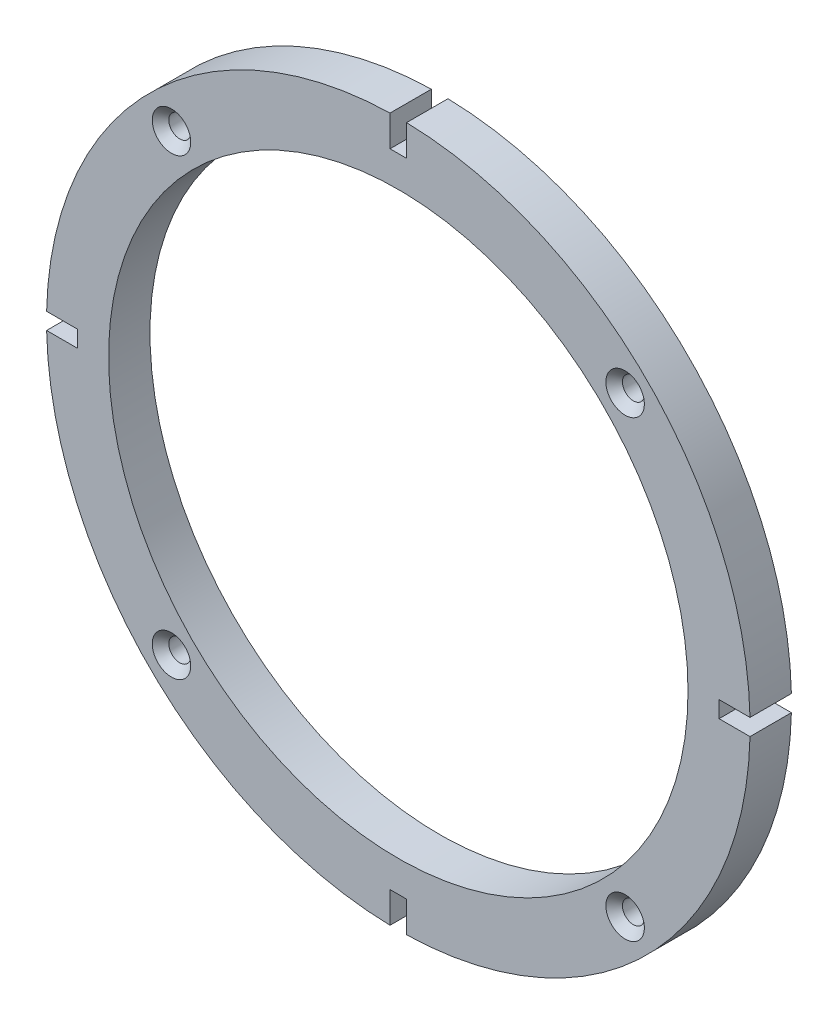
ISO-10303-21;
HEADER;
FILE_DESCRIPTION(('STEP AP214'),'2;1');
FILE_NAME('part.step','',(''),(''),'','','');
FILE_SCHEMA(('AUTOMOTIVE_DESIGN { 1 0 10303 214 1 1 1 1 }'));
ENDSEC;
DATA;
#1=APPLICATION_CONTEXT('core data for automotive mechanical design processes');
#2=APPLICATION_PROTOCOL_DEFINITION('international standard','automotive_design',2000,#1);
#3=PRODUCT_CONTEXT('',#1,'mechanical');
#4=PRODUCT('Part','Part','',(#3));
#5=PRODUCT_RELATED_PRODUCT_CATEGORY('part','',(#4));
#6=PRODUCT_DEFINITION_FORMATION('','',#4);
#7=PRODUCT_DEFINITION_CONTEXT('part definition',#1,'design');
#8=PRODUCT_DEFINITION('design','',#6,#7);
#9=PRODUCT_DEFINITION_SHAPE('','',#8);
#10=(LENGTH_UNIT() NAMED_UNIT(*) SI_UNIT(.MILLI.,.METRE.));
#11=(NAMED_UNIT(*) PLANE_ANGLE_UNIT() SI_UNIT($,.RADIAN.));
#12=(NAMED_UNIT(*) SI_UNIT($,.STERADIAN.) SOLID_ANGLE_UNIT());
#13=UNCERTAINTY_MEASURE_WITH_UNIT(LENGTH_MEASURE(1.E-05),#10,'distance_accuracy_value','');
#14=(GEOMETRIC_REPRESENTATION_CONTEXT(3) GLOBAL_UNCERTAINTY_ASSIGNED_CONTEXT((#13)) GLOBAL_UNIT_ASSIGNED_CONTEXT((#10,
#11,#12)) REPRESENTATION_CONTEXT('',''));
#15=CARTESIAN_POINT('',(0.,0.,0.));
#16=DIRECTION('',(0.,0.,1.));
#17=DIRECTION('',(1.,0.,0.));
#18=AXIS2_PLACEMENT_3D('',#15,#16,#17);
#19=CARTESIAN_POINT('',(-54.8007755419571,54.8007755419608,10.));
#20=DIRECTION('',(0.,0.,-1.));
#21=DIRECTION('',(-1.,0.,0.));
#22=AXIS2_PLACEMENT_3D('',#19,#20,#21);
#23=CYLINDRICAL_SURFACE('',#22,2.65);
#24=CARTESIAN_POINT('',(-54.8007755419571,54.8007755419608,8.00000000000001));
#25=DIRECTION('',(0.,0.,1.));
#26=DIRECTION('',(1.,0.,0.));
#27=AXIS2_PLACEMENT_3D('',#24,#25,#26);
#28=CIRCLE('',#27,2.65);
#29=CARTESIAN_POINT('',(-52.1507755419571,54.8007755419608,8.00000000000001));
#30=VERTEX_POINT('',#29);
#31=EDGE_CURVE('E347',#30,#30,#28,.T.);
#32=ORIENTED_EDGE('',*,*,#31,.T.);
#33=EDGE_LOOP('',(#32));
#34=FACE_BOUND('',#33,.T.);
#35=CARTESIAN_POINT('',(-54.8007755419571,54.8007755419608,2.));
#36=DIRECTION('',(0.,0.,-1.));
#37=DIRECTION('',(-1.,0.,0.));
#38=AXIS2_PLACEMENT_3D('',#35,#36,#37);
#39=CIRCLE('',#38,2.65);
#40=CARTESIAN_POINT('',(-57.4507755419571,54.8007755419608,2.));
#41=VERTEX_POINT('',#40);
#42=EDGE_CURVE('E329',#41,#41,#39,.F.);
#43=ORIENTED_EDGE('',*,*,#42,.F.);
#44=EDGE_LOOP('',(#43));
#45=FACE_BOUND('',#44,.T.);
#46=ADVANCED_FACE('F94',(#34,#45),#23,.F.);
#47=CARTESIAN_POINT('',(-54.8007755419608,-54.8007755419541,10.));
#48=DIRECTION('',(0.,0.,-1.));
#49=DIRECTION('',(-1.,0.,0.));
#50=AXIS2_PLACEMENT_3D('',#47,#48,#49);
#51=CYLINDRICAL_SURFACE('',#50,2.65);
#52=CARTESIAN_POINT('',(-54.8007755419608,-54.8007755419541,8.00000000000001));
#53=DIRECTION('',(0.,0.,1.));
#54=DIRECTION('',(1.,0.,0.));
#55=AXIS2_PLACEMENT_3D('',#52,#53,#54);
#56=CIRCLE('',#55,2.65);
#57=CARTESIAN_POINT('',(-52.1507755419608,-54.8007755419541,8.00000000000001));
#58=VERTEX_POINT('',#57);
#59=EDGE_CURVE('E104',#58,#58,#56,.T.);
#60=ORIENTED_EDGE('',*,*,#59,.T.);
#61=EDGE_LOOP('',(#60));
#62=FACE_BOUND('',#61,.T.);
#63=CARTESIAN_POINT('',(-54.8007755419608,-54.8007755419541,2.));
#64=DIRECTION('',(0.,0.,-1.));
#65=DIRECTION('',(-1.,0.,0.));
#66=AXIS2_PLACEMENT_3D('',#63,#64,#65);
#67=CIRCLE('',#66,2.65);
#68=CARTESIAN_POINT('',(-57.4507755419608,-54.8007755419541,2.));
#69=VERTEX_POINT('',#68);
#70=EDGE_CURVE('E325',#69,#69,#67,.F.);
#71=ORIENTED_EDGE('',*,*,#70,.F.);
#72=EDGE_LOOP('',(#71));
#73=FACE_BOUND('',#72,.T.);
#74=ADVANCED_FACE('F352',(#62,#73),#51,.F.);
#75=CARTESIAN_POINT('',(54.8007755419541,-54.8007755419578,10.));
#76=DIRECTION('',(0.,0.,-1.));
#77=DIRECTION('',(-1.,0.,0.));
#78=AXIS2_PLACEMENT_3D('',#75,#76,#77);
#79=CYLINDRICAL_SURFACE('',#78,2.65);
#80=CARTESIAN_POINT('',(54.8007755419541,-54.8007755419578,8.00000000000001));
#81=DIRECTION('',(0.,0.,1.));
#82=DIRECTION('',(1.,0.,0.));
#83=AXIS2_PLACEMENT_3D('',#80,#81,#82);
#84=CIRCLE('',#83,2.65);
#85=CARTESIAN_POINT('',(57.4507755419541,-54.8007755419578,8.00000000000001));
#86=VERTEX_POINT('',#85);
#87=EDGE_CURVE('E12',#86,#86,#84,.T.);
#88=ORIENTED_EDGE('',*,*,#87,.T.);
#89=EDGE_LOOP('',(#88));
#90=FACE_BOUND('',#89,.T.);
#91=CARTESIAN_POINT('',(54.8007755419541,-54.8007755419578,2.));
#92=DIRECTION('',(0.,0.,-1.));
#93=DIRECTION('',(-1.,0.,0.));
#94=AXIS2_PLACEMENT_3D('',#91,#92,#93);
#95=CIRCLE('',#94,2.65);
#96=CARTESIAN_POINT('',(52.1507755419541,-54.8007755419578,2.));
#97=VERTEX_POINT('',#96);
#98=EDGE_CURVE('E322',#97,#97,#95,.F.);
#99=ORIENTED_EDGE('',*,*,#98,.F.);
#100=EDGE_LOOP('',(#99));
#101=FACE_BOUND('',#100,.T.);
#102=ADVANCED_FACE('F381',(#90,#101),#79,.F.);
#103=CARTESIAN_POINT('',(54.8007755419577,54.8007755419571,10.));
#104=DIRECTION('',(0.,0.,-1.));
#105=DIRECTION('',(-1.,0.,0.));
#106=AXIS2_PLACEMENT_3D('',#103,#104,#105);
#107=CYLINDRICAL_SURFACE('',#106,2.65);
#108=CARTESIAN_POINT('',(54.8007755419577,54.8007755419571,8.00000000000001));
#109=DIRECTION('',(0.,0.,1.));
#110=DIRECTION('',(1.,0.,0.));
#111=AXIS2_PLACEMENT_3D('',#108,#109,#110);
#112=CIRCLE('',#111,2.65);
#113=CARTESIAN_POINT('',(57.4507755419577,54.8007755419571,8.00000000000001));
#114=VERTEX_POINT('',#113);
#115=EDGE_CURVE('E344',#114,#114,#112,.T.);
#116=ORIENTED_EDGE('',*,*,#115,.T.);
#117=EDGE_LOOP('',(#116));
#118=FACE_BOUND('',#117,.T.);
#119=CARTESIAN_POINT('',(54.8007755419577,54.8007755419571,2.));
#120=DIRECTION('',(0.,0.,-1.));
#121=DIRECTION('',(-1.,0.,0.));
#122=AXIS2_PLACEMENT_3D('',#119,#120,#121);
#123=CIRCLE('',#122,2.65);
#124=CARTESIAN_POINT('',(52.1507755419577,54.8007755419571,2.));
#125=VERTEX_POINT('',#124);
#126=EDGE_CURVE('E317',#125,#125,#123,.F.);
#127=ORIENTED_EDGE('',*,*,#126,.F.);
#128=EDGE_LOOP('',(#127));
#129=FACE_BOUND('',#128,.T.);
#130=ADVANCED_FACE('F364',(#118,#129),#107,.F.);
#131=CARTESIAN_POINT('',(0.,0.,10.));
#132=DIRECTION('',(0.,0.,1.));
#133=DIRECTION('',(1.,0.,0.));
#134=AXIS2_PLACEMENT_3D('',#131,#132,#133);
#135=PLANE('',#134);
#136=CARTESIAN_POINT('',(54.8007755419577,54.8007755419571,10.));
#137=DIRECTION('',(0.,0.,1.));
#138=DIRECTION('',(1.,0.,0.));
#139=AXIS2_PLACEMENT_3D('',#136,#137,#138);
#140=CIRCLE('',#139,4.64999999999999);
#141=CARTESIAN_POINT('',(59.4507755419577,54.8007755419571,10.));
#142=VERTEX_POINT('',#141);
#143=EDGE_CURVE('E341',#142,#142,#140,.F.);
#144=ORIENTED_EDGE('',*,*,#143,.T.);
#145=EDGE_LOOP('',(#144));
#146=FACE_BOUND('',#145,.T.);
#147=CARTESIAN_POINT('',(-54.8007755419571,54.8007755419608,10.));
#148=DIRECTION('',(0.,0.,1.));
#149=DIRECTION('',(1.,0.,0.));
#150=AXIS2_PLACEMENT_3D('',#147,#148,#149);
#151=CIRCLE('',#150,4.64999999999999);
#152=CARTESIAN_POINT('',(-50.1507755419572,54.8007755419608,10.));
#153=VERTEX_POINT('',#152);
#154=EDGE_CURVE('E338',#153,#153,#151,.F.);
#155=ORIENTED_EDGE('',*,*,#154,.T.);
#156=EDGE_LOOP('',(#155));
#157=FACE_BOUND('',#156,.T.);
#158=CARTESIAN_POINT('',(-54.8007755419608,-54.8007755419541,10.));
#159=DIRECTION('',(0.,0.,1.));
#160=DIRECTION('',(1.,0.,0.));
#161=AXIS2_PLACEMENT_3D('',#158,#159,#160);
#162=CIRCLE('',#161,4.64999999999999);
#163=CARTESIAN_POINT('',(-50.1507755419608,-54.8007755419541,10.));
#164=VERTEX_POINT('',#163);
#165=EDGE_CURVE('E335',#164,#164,#162,.F.);
#166=ORIENTED_EDGE('',*,*,#165,.T.);
#167=EDGE_LOOP('',(#166));
#168=FACE_BOUND('',#167,.T.);
#169=CARTESIAN_POINT('',(54.8007755419541,-54.8007755419578,10.));
#170=DIRECTION('',(0.,0.,1.));
#171=DIRECTION('',(1.,0.,0.));
#172=AXIS2_PLACEMENT_3D('',#169,#170,#171);
#173=CIRCLE('',#172,4.64999999999999);
#174=CARTESIAN_POINT('',(59.450775541954,-54.8007755419578,10.));
#175=VERTEX_POINT('',#174);
#176=EDGE_CURVE('E316',#175,#175,#173,.F.);
#177=ORIENTED_EDGE('',*,*,#176,.T.);
#178=EDGE_LOOP('',(#177));
#179=FACE_BOUND('',#178,.T.);
#180=DIRECTION('',(0.,1.,0.));
#181=VECTOR('',#180,1.);
#182=CARTESIAN_POINT('',(-2.00000000000001,77.4995551438957,10.));
#183=LINE('',#182,#181);
#184=CARTESIAN_POINT('',(-2.00000000000001,77.4995551438957,10.));
#185=VERTEX_POINT('',#184);
#186=CARTESIAN_POINT('',(-2.00000000000001,84.9764673306675,10.));
#187=VERTEX_POINT('',#186);
#188=EDGE_CURVE('E283',#185,#187,#183,.T.);
#189=ORIENTED_EDGE('',*,*,#188,.T.);
#190=CARTESIAN_POINT('',(0.,0.,10.));
#191=DIRECTION('',(0.,0.,1.));
#192=DIRECTION('',(1.,0.,0.));
#193=AXIS2_PLACEMENT_3D('',#190,#191,#192);
#194=CIRCLE('',#193,85.);
#195=CARTESIAN_POINT('',(-84.9764673306675,1.99999999999997,10.));
#196=VERTEX_POINT('',#195);
#197=EDGE_CURVE('E176',#187,#196,#194,.T.);
#198=ORIENTED_EDGE('',*,*,#197,.T.);
#199=DIRECTION('',(1.,0.,0.));
#200=VECTOR('',#199,1.);
#201=CARTESIAN_POINT('',(-84.9764673306675,1.99999999999997,10.));
#202=LINE('',#201,#200);
#203=CARTESIAN_POINT('',(-77.4995551438957,1.99999999999998,10.));
#204=VERTEX_POINT('',#203);
#205=EDGE_CURVE('E731',#196,#204,#202,.T.);
#206=ORIENTED_EDGE('',*,*,#205,.T.);
#207=DIRECTION('',(0.,1.,0.));
#208=VECTOR('',#207,1.);
#209=CARTESIAN_POINT('',(-77.4995551438957,-2.00000000000003,10.));
#210=LINE('',#209,#208);
#211=CARTESIAN_POINT('',(-77.4995551438957,-2.00000000000003,10.));
#212=VERTEX_POINT('',#211);
#213=EDGE_CURVE('E733',#212,#204,#210,.T.);
#214=ORIENTED_EDGE('',*,*,#213,.F.);
#215=DIRECTION('',(-1.,0.,0.));
#216=VECTOR('',#215,1.);
#217=CARTESIAN_POINT('',(-77.4995551438957,-2.00000000000003,10.));
#218=LINE('',#217,#216);
#219=CARTESIAN_POINT('',(-84.9764673306675,-2.00000000000003,10.));
#220=VERTEX_POINT('',#219);
#221=EDGE_CURVE('E736',#212,#220,#218,.T.);
#222=ORIENTED_EDGE('',*,*,#221,.T.);
#223=CARTESIAN_POINT('',(0.,0.,10.));
#224=DIRECTION('',(0.,0.,1.));
#225=DIRECTION('',(1.,0.,0.));
#226=AXIS2_PLACEMENT_3D('',#223,#224,#225);
#227=CIRCLE('',#226,85.);
#228=CARTESIAN_POINT('',(-2.00000000000001,-84.9764673306675,10.));
#229=VERTEX_POINT('',#228);
#230=EDGE_CURVE('E738',#220,#229,#227,.T.);
#231=ORIENTED_EDGE('',*,*,#230,.T.);
#232=DIRECTION('',(0.,1.,0.));
#233=VECTOR('',#232,1.);
#234=CARTESIAN_POINT('',(-1.99999999999998,-84.9764673306675,10.));
#235=LINE('',#234,#233);
#236=CARTESIAN_POINT('',(-1.99999999999998,-77.4995551438957,10.));
#237=VERTEX_POINT('',#236);
#238=EDGE_CURVE('E740',#229,#237,#235,.T.);
#239=ORIENTED_EDGE('',*,*,#238,.T.);
#240=DIRECTION('',(-1.,0.,0.));
#241=VECTOR('',#240,1.);
#242=CARTESIAN_POINT('',(2.00000000000002,-77.4995551438957,10.));
#243=LINE('',#242,#241);
#244=CARTESIAN_POINT('',(2.00000000000002,-77.4995551438957,10.));
#245=VERTEX_POINT('',#244);
#246=EDGE_CURVE('E742',#245,#237,#243,.T.);
#247=ORIENTED_EDGE('',*,*,#246,.F.);
#248=DIRECTION('',(0.,-1.,0.));
#249=VECTOR('',#248,1.);
#250=CARTESIAN_POINT('',(2.00000000000002,-77.4995551438957,10.));
#251=LINE('',#250,#249);
#252=CARTESIAN_POINT('',(2.00000000000002,-84.9764673306675,10.));
#253=VERTEX_POINT('',#252);
#254=EDGE_CURVE('E745',#245,#253,#251,.T.);
#255=ORIENTED_EDGE('',*,*,#254,.T.);
#256=CARTESIAN_POINT('',(0.,0.,10.));
#257=DIRECTION('',(0.,0.,1.));
#258=DIRECTION('',(1.,0.,0.));
#259=AXIS2_PLACEMENT_3D('',#256,#257,#258);
#260=CIRCLE('',#259,85.);
#261=CARTESIAN_POINT('',(84.9764673306675,-2.00000000000001,10.));
#262=VERTEX_POINT('',#261);
#263=EDGE_CURVE('E747',#253,#262,#260,.T.);
#264=ORIENTED_EDGE('',*,*,#263,.T.);
#265=DIRECTION('',(-1.,0.,0.));
#266=VECTOR('',#265,1.);
#267=CARTESIAN_POINT('',(84.9764673306675,-1.99999999999998,10.));
#268=LINE('',#267,#266);
#269=CARTESIAN_POINT('',(77.4995551438957,-1.99999999999999,10.));
#270=VERTEX_POINT('',#269);
#271=EDGE_CURVE('E749',#262,#270,#268,.T.);
#272=ORIENTED_EDGE('',*,*,#271,.T.);
#273=DIRECTION('',(0.,-1.,0.));
#274=VECTOR('',#273,1.);
#275=CARTESIAN_POINT('',(77.4995551438957,2.00000000000002,10.));
#276=LINE('',#275,#274);
#277=CARTESIAN_POINT('',(77.4995551438957,2.00000000000002,10.));
#278=VERTEX_POINT('',#277);
#279=EDGE_CURVE('E751',#278,#270,#276,.T.);
#280=ORIENTED_EDGE('',*,*,#279,.F.);
#281=DIRECTION('',(1.,0.,0.));
#282=VECTOR('',#281,1.);
#283=CARTESIAN_POINT('',(77.4995551438957,2.00000000000002,10.));
#284=LINE('',#283,#282);
#285=CARTESIAN_POINT('',(84.9764673306675,2.00000000000002,10.));
#286=VERTEX_POINT('',#285);
#287=EDGE_CURVE('E224',#278,#286,#284,.T.);
#288=ORIENTED_EDGE('',*,*,#287,.T.);
#289=CARTESIAN_POINT('',(0.,0.,10.));
#290=DIRECTION('',(0.,0.,1.));
#291=DIRECTION('',(1.,0.,0.));
#292=AXIS2_PLACEMENT_3D('',#289,#290,#291);
#293=CIRCLE('',#292,85.);
#294=CARTESIAN_POINT('',(2.,84.9764673306675,10.));
#295=VERTEX_POINT('',#294);
#296=EDGE_CURVE('E215',#286,#295,#293,.T.);
#297=ORIENTED_EDGE('',*,*,#296,.T.);
#298=DIRECTION('',(0.,-1.,0.));
#299=VECTOR('',#298,1.);
#300=CARTESIAN_POINT('',(1.99999999999999,84.9764673306675,10.));
#301=LINE('',#300,#299);
#302=CARTESIAN_POINT('',(1.99999999999999,77.4995551438957,10.));
#303=VERTEX_POINT('',#302);
#304=EDGE_CURVE('E221',#295,#303,#301,.T.);
#305=ORIENTED_EDGE('',*,*,#304,.T.);
#306=DIRECTION('',(1.,0.,0.));
#307=VECTOR('',#306,1.);
#308=CARTESIAN_POINT('',(-2.00000000000001,77.4995551438957,10.));
#309=LINE('',#308,#307);
#310=EDGE_CURVE('E239',#185,#303,#309,.T.);
#311=ORIENTED_EDGE('',*,*,#310,.F.);
#312=EDGE_LOOP('',(#189,#198,#206,#214,#222,#231,#239,#247,#255,#264,#272,#280,#288,#297,#305,#311));
#313=FACE_BOUND('',#312,.T.);
#314=CARTESIAN_POINT('',(0.,0.,10.));
#315=DIRECTION('',(0.,0.,1.));
#316=DIRECTION('',(1.,0.,0.));
#317=AXIS2_PLACEMENT_3D('',#314,#315,#316);
#318=CIRCLE('',#317,70.);
#319=CARTESIAN_POINT('',(70.,0.,10.));
#320=VERTEX_POINT('',#319);
#321=EDGE_CURVE('E247',#320,#320,#318,.T.);
#322=ORIENTED_EDGE('',*,*,#321,.F.);
#323=EDGE_LOOP('',(#322));
#324=FACE_BOUND('',#323,.T.);
#325=ADVANCED_FACE('F217',(#146,#157,#168,#179,#313,#324),#135,.T.);
#326=CARTESIAN_POINT('',(0.,0.,0.));
#327=DIRECTION('',(0.,0.,1.));
#328=DIRECTION('',(1.,0.,0.));
#329=AXIS2_PLACEMENT_3D('',#326,#327,#328);
#330=PLANE('',#329);
#331=CARTESIAN_POINT('',(54.8007755419569,-54.8007755419579,0.));
#332=DIRECTION('',(0.,0.,-1.));
#333=DIRECTION('',(0.,1.,0.));
#334=AXIS2_PLACEMENT_3D('',#331,#332,#333);
#335=CIRCLE('',#334,5.);
#336=CARTESIAN_POINT('',(54.8007755419569,-49.8007755419579,0.));
#337=VERTEX_POINT('',#336);
#338=EDGE_CURVE('E796',#337,#337,#335,.T.);
#339=ORIENTED_EDGE('',*,*,#338,.F.);
#340=EDGE_LOOP('',(#339));
#341=FACE_BOUND('',#340,.T.);
#342=CARTESIAN_POINT('',(-54.8007755419577,-54.8007755419571,0.));
#343=DIRECTION('',(0.,0.,-1.));
#344=DIRECTION('',(1.,0.,0.));
#345=AXIS2_PLACEMENT_3D('',#342,#343,#344);
#346=CIRCLE('',#345,5.);
#347=CARTESIAN_POINT('',(-49.8007755419577,-54.8007755419571,0.));
#348=VERTEX_POINT('',#347);
#349=EDGE_CURVE('E790',#348,#348,#346,.T.);
#350=ORIENTED_EDGE('',*,*,#349,.F.);
#351=EDGE_LOOP('',(#350));
#352=FACE_BOUND('',#351,.T.);
#353=CARTESIAN_POINT('',(-54.8007755419565,54.8007755419583,0.));
#354=DIRECTION('',(0.,0.,-1.));
#355=DIRECTION('',(0.,-1.,0.));
#356=AXIS2_PLACEMENT_3D('',#353,#354,#355);
#357=CIRCLE('',#356,5.);
#358=CARTESIAN_POINT('',(-54.8007755419566,49.8007755419583,0.));
#359=VERTEX_POINT('',#358);
#360=EDGE_CURVE('E722',#359,#359,#357,.T.);
#361=ORIENTED_EDGE('',*,*,#360,.F.);
#362=EDGE_LOOP('',(#361));
#363=FACE_BOUND('',#362,.T.);
#364=CARTESIAN_POINT('',(54.8007755419577,54.8007755419571,0.));
#365=DIRECTION('',(0.,0.,-1.));
#366=DIRECTION('',(-1.,0.,0.));
#367=AXIS2_PLACEMENT_3D('',#364,#365,#366);
#368=CIRCLE('',#367,5.);
#369=CARTESIAN_POINT('',(49.8007755419577,54.8007755419571,0.));
#370=VERTEX_POINT('',#369);
#371=EDGE_CURVE('E332',#370,#370,#368,.T.);
#372=ORIENTED_EDGE('',*,*,#371,.F.);
#373=EDGE_LOOP('',(#372));
#374=FACE_BOUND('',#373,.T.);
#375=DIRECTION('',(0.,1.,0.));
#376=VECTOR('',#375,1.);
#377=CARTESIAN_POINT('',(-2.00000000000001,77.4995551438957,0.));
#378=LINE('',#377,#376);
#379=CARTESIAN_POINT('',(-2.00000000000001,77.4995551438957,0.));
#380=VERTEX_POINT('',#379);
#381=CARTESIAN_POINT('',(-2.00000000000001,84.9764673306675,0.));
#382=VERTEX_POINT('',#381);
#383=EDGE_CURVE('E244',#380,#382,#378,.T.);
#384=ORIENTED_EDGE('',*,*,#383,.F.);
#385=DIRECTION('',(1.,0.,0.));
#386=VECTOR('',#385,1.);
#387=CARTESIAN_POINT('',(-2.00000000000001,77.4995551438957,0.));
#388=LINE('',#387,#386);
#389=CARTESIAN_POINT('',(1.99999999999999,77.4995551438957,0.));
#390=VERTEX_POINT('',#389);
#391=EDGE_CURVE('E280',#380,#390,#388,.T.);
#392=ORIENTED_EDGE('',*,*,#391,.T.);
#393=DIRECTION('',(0.,-1.,0.));
#394=VECTOR('',#393,1.);
#395=CARTESIAN_POINT('',(1.99999999999999,84.9764673306675,0.));
#396=LINE('',#395,#394);
#397=CARTESIAN_POINT('',(2.,84.9764673306675,0.));
#398=VERTEX_POINT('',#397);
#399=EDGE_CURVE('E278',#398,#390,#396,.T.);
#400=ORIENTED_EDGE('',*,*,#399,.F.);
#401=CARTESIAN_POINT('',(0.,0.,0.));
#402=DIRECTION('',(0.,0.,1.));
#403=DIRECTION('',(1.,0.,0.));
#404=AXIS2_PLACEMENT_3D('',#401,#402,#403);
#405=CIRCLE('',#404,85.);
#406=CARTESIAN_POINT('',(84.9764673306675,2.00000000000002,0.));
#407=VERTEX_POINT('',#406);
#408=EDGE_CURVE('E233',#407,#398,#405,.T.);
#409=ORIENTED_EDGE('',*,*,#408,.F.);
#410=DIRECTION('',(1.,0.,0.));
#411=VECTOR('',#410,1.);
#412=CARTESIAN_POINT('',(77.4995551438957,2.00000000000002,0.));
#413=LINE('',#412,#411);
#414=CARTESIAN_POINT('',(77.4995551438957,2.00000000000002,0.));
#415=VERTEX_POINT('',#414);
#416=EDGE_CURVE('E275',#415,#407,#413,.T.);
#417=ORIENTED_EDGE('',*,*,#416,.F.);
#418=DIRECTION('',(0.,-1.,0.));
#419=VECTOR('',#418,1.);
#420=CARTESIAN_POINT('',(77.4995551438957,2.00000000000002,0.));
#421=LINE('',#420,#419);
#422=CARTESIAN_POINT('',(77.4995551438957,-1.99999999999999,0.));
#423=VERTEX_POINT('',#422);
#424=EDGE_CURVE('E272',#415,#423,#421,.T.);
#425=ORIENTED_EDGE('',*,*,#424,.T.);
#426=DIRECTION('',(-1.,0.,0.));
#427=VECTOR('',#426,1.);
#428=CARTESIAN_POINT('',(84.9764673306675,-1.99999999999998,0.));
#429=LINE('',#428,#427);
#430=CARTESIAN_POINT('',(84.9764673306675,-2.00000000000001,0.));
#431=VERTEX_POINT('',#430);
#432=EDGE_CURVE('E269',#431,#423,#429,.T.);
#433=ORIENTED_EDGE('',*,*,#432,.F.);
#434=CARTESIAN_POINT('',(0.,0.,0.));
#435=DIRECTION('',(0.,0.,1.));
#436=DIRECTION('',(1.,0.,0.));
#437=AXIS2_PLACEMENT_3D('',#434,#435,#436);
#438=CIRCLE('',#437,85.);
#439=CARTESIAN_POINT('',(2.00000000000002,-84.9764673306675,0.));
#440=VERTEX_POINT('',#439);
#441=EDGE_CURVE('E267',#440,#431,#438,.T.);
#442=ORIENTED_EDGE('',*,*,#441,.F.);
#443=DIRECTION('',(0.,-1.,0.));
#444=VECTOR('',#443,1.);
#445=CARTESIAN_POINT('',(2.00000000000002,-77.4995551438957,0.));
#446=LINE('',#445,#444);
#447=CARTESIAN_POINT('',(2.00000000000002,-77.4995551438957,0.));
#448=VERTEX_POINT('',#447);
#449=EDGE_CURVE('E265',#448,#440,#446,.T.);
#450=ORIENTED_EDGE('',*,*,#449,.F.);
#451=DIRECTION('',(-1.,0.,0.));
#452=VECTOR('',#451,1.);
#453=CARTESIAN_POINT('',(2.00000000000002,-77.4995551438957,0.));
#454=LINE('',#453,#452);
#455=CARTESIAN_POINT('',(-1.99999999999998,-77.4995551438957,0.));
#456=VERTEX_POINT('',#455);
#457=EDGE_CURVE('E262',#448,#456,#454,.T.);
#458=ORIENTED_EDGE('',*,*,#457,.T.);
#459=DIRECTION('',(0.,1.,0.));
#460=VECTOR('',#459,1.);
#461=CARTESIAN_POINT('',(-1.99999999999998,-84.9764673306675,0.));
#462=LINE('',#461,#460);
#463=CARTESIAN_POINT('',(-2.00000000000001,-84.9764673306675,0.));
#464=VERTEX_POINT('',#463);
#465=EDGE_CURVE('E259',#464,#456,#462,.T.);
#466=ORIENTED_EDGE('',*,*,#465,.F.);
#467=CARTESIAN_POINT('',(0.,0.,0.));
#468=DIRECTION('',(0.,0.,1.));
#469=DIRECTION('',(1.,0.,0.));
#470=AXIS2_PLACEMENT_3D('',#467,#468,#469);
#471=CIRCLE('',#470,85.);
#472=CARTESIAN_POINT('',(-84.9764673306675,-2.00000000000003,0.));
#473=VERTEX_POINT('',#472);
#474=EDGE_CURVE('E257',#473,#464,#471,.T.);
#475=ORIENTED_EDGE('',*,*,#474,.F.);
#476=DIRECTION('',(-1.,0.,0.));
#477=VECTOR('',#476,1.);
#478=CARTESIAN_POINT('',(-77.4995551438957,-2.00000000000003,0.));
#479=LINE('',#478,#477);
#480=CARTESIAN_POINT('',(-77.4995551438957,-2.00000000000003,0.));
#481=VERTEX_POINT('',#480);
#482=EDGE_CURVE('E255',#481,#473,#479,.T.);
#483=ORIENTED_EDGE('',*,*,#482,.F.);
#484=DIRECTION('',(0.,1.,0.));
#485=VECTOR('',#484,1.);
#486=CARTESIAN_POINT('',(-77.4995551438957,-2.00000000000003,0.));
#487=LINE('',#486,#485);
#488=CARTESIAN_POINT('',(-77.4995551438957,1.99999999999998,0.));
#489=VERTEX_POINT('',#488);
#490=EDGE_CURVE('E252',#481,#489,#487,.T.);
#491=ORIENTED_EDGE('',*,*,#490,.T.);
#492=DIRECTION('',(1.,0.,0.));
#493=VECTOR('',#492,1.);
#494=CARTESIAN_POINT('',(-84.9764673306675,1.99999999999997,0.));
#495=LINE('',#494,#493);
#496=CARTESIAN_POINT('',(-84.9764673306675,1.99999999999997,0.));
#497=VERTEX_POINT('',#496);
#498=EDGE_CURVE('E249',#497,#489,#495,.T.);
#499=ORIENTED_EDGE('',*,*,#498,.F.);
#500=CARTESIAN_POINT('',(0.,0.,0.));
#501=DIRECTION('',(0.,0.,1.));
#502=DIRECTION('',(1.,0.,0.));
#503=AXIS2_PLACEMENT_3D('',#500,#501,#502);
#504=CIRCLE('',#503,85.);
#505=EDGE_CURVE('E246',#382,#497,#504,.T.);
#506=ORIENTED_EDGE('',*,*,#505,.F.);
#507=EDGE_LOOP('',(#384,#392,#400,#409,#417,#425,#433,#442,#450,#458,#466,#475,#483,#491,#499,#506));
#508=FACE_BOUND('',#507,.T.);
#509=CARTESIAN_POINT('',(0.,0.,0.));
#510=DIRECTION('',(0.,0.,1.));
#511=DIRECTION('',(1.,0.,0.));
#512=AXIS2_PLACEMENT_3D('',#509,#510,#511);
#513=CIRCLE('',#512,70.);
#514=CARTESIAN_POINT('',(70.,0.,0.));
#515=VERTEX_POINT('',#514);
#516=EDGE_CURVE('E320',#515,#515,#513,.T.);
#517=ORIENTED_EDGE('',*,*,#516,.T.);
#518=EDGE_LOOP('',(#517));
#519=FACE_BOUND('',#518,.T.);
#520=ADVANCED_FACE('F363',(#341,#352,#363,#374,#508,#519),#330,.F.);
#521=CARTESIAN_POINT('',(-2.00000000000001,77.4995551438957,10.));
#522=DIRECTION('',(-1.,0.,0.));
#523=DIRECTION('',(0.,0.,1.));
#524=AXIS2_PLACEMENT_3D('',#521,#522,#523);
#525=PLANE('',#524);
#526=ORIENTED_EDGE('',*,*,#383,.T.);
#527=DIRECTION('',(0.,0.,-1.));
#528=VECTOR('',#527,1.);
#529=CARTESIAN_POINT('',(-2.00000000000001,84.9764673306675,10.));
#530=LINE('',#529,#528);
#531=EDGE_CURVE('E314',#187,#382,#530,.T.);
#532=ORIENTED_EDGE('',*,*,#531,.F.);
#533=ORIENTED_EDGE('',*,*,#188,.F.);
#534=DIRECTION('',(0.,0.,-1.));
#535=VECTOR('',#534,1.);
#536=CARTESIAN_POINT('',(-2.00000000000001,77.4995551438957,10.));
#537=LINE('',#536,#535);
#538=EDGE_CURVE('E112',#185,#380,#537,.T.);
#539=ORIENTED_EDGE('',*,*,#538,.T.);
#540=EDGE_LOOP('',(#526,#532,#533,#539));
#541=FACE_BOUND('',#540,.T.);
#542=ADVANCED_FACE('F402',(#541),#525,.F.);
#543=CARTESIAN_POINT('',(0.,0.,10.));
#544=DIRECTION('',(0.,0.,-1.));
#545=DIRECTION('',(-1.,0.,0.));
#546=AXIS2_PLACEMENT_3D('',#543,#544,#545);
#547=CYLINDRICAL_SURFACE('',#546,85.);
#548=ORIENTED_EDGE('',*,*,#505,.T.);
#549=DIRECTION('',(0.,0.,-1.));
#550=VECTOR('',#549,1.);
#551=CARTESIAN_POINT('',(-84.9764673306675,1.99999999999997,10.));
#552=LINE('',#551,#550);
#553=EDGE_CURVE('E311',#196,#497,#552,.T.);
#554=ORIENTED_EDGE('',*,*,#553,.F.);
#555=ORIENTED_EDGE('',*,*,#197,.F.);
#556=ORIENTED_EDGE('',*,*,#531,.T.);
#557=EDGE_LOOP('',(#548,#554,#555,#556));
#558=FACE_BOUND('',#557,.T.);
#559=ADVANCED_FACE('F453',(#558),#547,.T.);
#560=CARTESIAN_POINT('',(-84.9764673306675,1.99999999999997,10.));
#561=DIRECTION('',(0.,1.,0.));
#562=DIRECTION('',(-1.,0.,0.));
#563=AXIS2_PLACEMENT_3D('',#560,#561,#562);
#564=PLANE('',#563);
#565=ORIENTED_EDGE('',*,*,#498,.T.);
#566=DIRECTION('',(0.,0.,-1.));
#567=VECTOR('',#566,1.);
#568=CARTESIAN_POINT('',(-77.4995551438957,1.99999999999998,10.));
#569=LINE('',#568,#567);
#570=EDGE_CURVE('E309',#204,#489,#569,.T.);
#571=ORIENTED_EDGE('',*,*,#570,.F.);
#572=ORIENTED_EDGE('',*,*,#205,.F.);
#573=ORIENTED_EDGE('',*,*,#553,.T.);
#574=EDGE_LOOP('',(#565,#571,#572,#573));
#575=FACE_BOUND('',#574,.T.);
#576=ADVANCED_FACE('F449',(#575),#564,.F.);
#577=CARTESIAN_POINT('',(-77.4995551438957,-2.00000000000003,10.));
#578=DIRECTION('',(-1.,0.,0.));
#579=DIRECTION('',(0.,0.,1.));
#580=AXIS2_PLACEMENT_3D('',#577,#578,#579);
#581=PLANE('',#580);
#582=ORIENTED_EDGE('',*,*,#490,.F.);
#583=DIRECTION('',(0.,0.,-1.));
#584=VECTOR('',#583,1.);
#585=CARTESIAN_POINT('',(-77.4995551438957,-2.00000000000003,10.));
#586=LINE('',#585,#584);
#587=EDGE_CURVE('E307',#212,#481,#586,.T.);
#588=ORIENTED_EDGE('',*,*,#587,.F.);
#589=ORIENTED_EDGE('',*,*,#213,.T.);
#590=ORIENTED_EDGE('',*,*,#570,.T.);
#591=EDGE_LOOP('',(#582,#588,#589,#590));
#592=FACE_BOUND('',#591,.T.);
#593=ADVANCED_FACE('F445',(#592),#581,.T.);
#594=CARTESIAN_POINT('',(-77.4995551438957,-2.00000000000003,10.));
#595=DIRECTION('',(0.,-1.,0.));
#596=DIRECTION('',(1.,0.,0.));
#597=AXIS2_PLACEMENT_3D('',#594,#595,#596);
#598=PLANE('',#597);
#599=ORIENTED_EDGE('',*,*,#482,.T.);
#600=DIRECTION('',(0.,0.,-1.));
#601=VECTOR('',#600,1.);
#602=CARTESIAN_POINT('',(-84.9764673306675,-2.00000000000003,10.));
#603=LINE('',#602,#601);
#604=EDGE_CURVE('E304',#220,#473,#603,.T.);
#605=ORIENTED_EDGE('',*,*,#604,.F.);
#606=ORIENTED_EDGE('',*,*,#221,.F.);
#607=ORIENTED_EDGE('',*,*,#587,.T.);
#608=EDGE_LOOP('',(#599,#605,#606,#607));
#609=FACE_BOUND('',#608,.T.);
#610=ADVANCED_FACE('F441',(#609),#598,.F.);
#611=CARTESIAN_POINT('',(0.,0.,10.));
#612=DIRECTION('',(0.,0.,-1.));
#613=DIRECTION('',(-1.,0.,0.));
#614=AXIS2_PLACEMENT_3D('',#611,#612,#613);
#615=CYLINDRICAL_SURFACE('',#614,85.);
#616=ORIENTED_EDGE('',*,*,#474,.T.);
#617=DIRECTION('',(0.,0.,-1.));
#618=VECTOR('',#617,1.);
#619=CARTESIAN_POINT('',(-2.00000000000001,-84.9764673306675,10.));
#620=LINE('',#619,#618);
#621=EDGE_CURVE('E301',#229,#464,#620,.T.);
#622=ORIENTED_EDGE('',*,*,#621,.F.);
#623=ORIENTED_EDGE('',*,*,#230,.F.);
#624=ORIENTED_EDGE('',*,*,#604,.T.);
#625=EDGE_LOOP('',(#616,#622,#623,#624));
#626=FACE_BOUND('',#625,.T.);
#627=ADVANCED_FACE('F437',(#626),#615,.T.);
#628=CARTESIAN_POINT('',(-1.99999999999998,-84.9764673306675,10.));
#629=DIRECTION('',(-1.,0.,0.));
#630=DIRECTION('',(0.,-1.,0.));
#631=AXIS2_PLACEMENT_3D('',#628,#629,#630);
#632=PLANE('',#631);
#633=ORIENTED_EDGE('',*,*,#465,.T.);
#634=DIRECTION('',(0.,0.,-1.));
#635=VECTOR('',#634,1.);
#636=CARTESIAN_POINT('',(-1.99999999999998,-77.4995551438957,10.));
#637=LINE('',#636,#635);
#638=EDGE_CURVE('E299',#237,#456,#637,.T.);
#639=ORIENTED_EDGE('',*,*,#638,.F.);
#640=ORIENTED_EDGE('',*,*,#238,.F.);
#641=ORIENTED_EDGE('',*,*,#621,.T.);
#642=EDGE_LOOP('',(#633,#639,#640,#641));
#643=FACE_BOUND('',#642,.T.);
#644=ADVANCED_FACE('F433',(#643),#632,.F.);
#645=CARTESIAN_POINT('',(2.00000000000002,-77.4995551438957,10.));
#646=DIRECTION('',(0.,-1.,0.));
#647=DIRECTION('',(0.,0.,-1.));
#648=AXIS2_PLACEMENT_3D('',#645,#646,#647);
#649=PLANE('',#648);
#650=ORIENTED_EDGE('',*,*,#457,.F.);
#651=DIRECTION('',(0.,0.,-1.));
#652=VECTOR('',#651,1.);
#653=CARTESIAN_POINT('',(2.00000000000002,-77.4995551438957,10.));
#654=LINE('',#653,#652);
#655=EDGE_CURVE('E297',#245,#448,#654,.T.);
#656=ORIENTED_EDGE('',*,*,#655,.F.);
#657=ORIENTED_EDGE('',*,*,#246,.T.);
#658=ORIENTED_EDGE('',*,*,#638,.T.);
#659=EDGE_LOOP('',(#650,#656,#657,#658));
#660=FACE_BOUND('',#659,.T.);
#661=ADVANCED_FACE('F429',(#660),#649,.T.);
#662=CARTESIAN_POINT('',(2.00000000000002,-77.4995551438957,10.));
#663=DIRECTION('',(1.,0.,0.));
#664=DIRECTION('',(0.,1.,0.));
#665=AXIS2_PLACEMENT_3D('',#662,#663,#664);
#666=PLANE('',#665);
#667=ORIENTED_EDGE('',*,*,#449,.T.);
#668=DIRECTION('',(0.,0.,-1.));
#669=VECTOR('',#668,1.);
#670=CARTESIAN_POINT('',(2.00000000000002,-84.9764673306675,10.));
#671=LINE('',#670,#669);
#672=EDGE_CURVE('E294',#253,#440,#671,.T.);
#673=ORIENTED_EDGE('',*,*,#672,.F.);
#674=ORIENTED_EDGE('',*,*,#254,.F.);
#675=ORIENTED_EDGE('',*,*,#655,.T.);
#676=EDGE_LOOP('',(#667,#673,#674,#675));
#677=FACE_BOUND('',#676,.T.);
#678=ADVANCED_FACE('F425',(#677),#666,.F.);
#679=CARTESIAN_POINT('',(0.,0.,10.));
#680=DIRECTION('',(0.,0.,-1.));
#681=DIRECTION('',(-1.,0.,0.));
#682=AXIS2_PLACEMENT_3D('',#679,#680,#681);
#683=CYLINDRICAL_SURFACE('',#682,85.);
#684=ORIENTED_EDGE('',*,*,#441,.T.);
#685=DIRECTION('',(0.,0.,-1.));
#686=VECTOR('',#685,1.);
#687=CARTESIAN_POINT('',(84.9764673306675,-2.00000000000001,10.));
#688=LINE('',#687,#686);
#689=EDGE_CURVE('E291',#262,#431,#688,.T.);
#690=ORIENTED_EDGE('',*,*,#689,.F.);
#691=ORIENTED_EDGE('',*,*,#263,.F.);
#692=ORIENTED_EDGE('',*,*,#672,.T.);
#693=EDGE_LOOP('',(#684,#690,#691,#692));
#694=FACE_BOUND('',#693,.T.);
#695=ADVANCED_FACE('F421',(#694),#683,.T.);
#696=CARTESIAN_POINT('',(84.9764673306675,-1.99999999999998,10.));
#697=DIRECTION('',(0.,-1.,0.));
#698=DIRECTION('',(1.,0.,0.));
#699=AXIS2_PLACEMENT_3D('',#696,#697,#698);
#700=PLANE('',#699);
#701=ORIENTED_EDGE('',*,*,#432,.T.);
#702=DIRECTION('',(0.,0.,-1.));
#703=VECTOR('',#702,1.);
#704=CARTESIAN_POINT('',(77.4995551438957,-1.99999999999999,10.));
#705=LINE('',#704,#703);
#706=EDGE_CURVE('E289',#270,#423,#705,.T.);
#707=ORIENTED_EDGE('',*,*,#706,.F.);
#708=ORIENTED_EDGE('',*,*,#271,.F.);
#709=ORIENTED_EDGE('',*,*,#689,.T.);
#710=EDGE_LOOP('',(#701,#707,#708,#709));
#711=FACE_BOUND('',#710,.T.);
#712=ADVANCED_FACE('F417',(#711),#700,.F.);
#713=CARTESIAN_POINT('',(77.4995551438957,2.00000000000002,10.));
#714=DIRECTION('',(1.,0.,0.));
#715=DIRECTION('',(0.,0.,-1.));
#716=AXIS2_PLACEMENT_3D('',#713,#714,#715);
#717=PLANE('',#716);
#718=ORIENTED_EDGE('',*,*,#424,.F.);
#719=DIRECTION('',(0.,0.,-1.));
#720=VECTOR('',#719,1.);
#721=CARTESIAN_POINT('',(77.4995551438957,2.00000000000002,10.));
#722=LINE('',#721,#720);
#723=EDGE_CURVE('E287',#278,#415,#722,.T.);
#724=ORIENTED_EDGE('',*,*,#723,.F.);
#725=ORIENTED_EDGE('',*,*,#279,.T.);
#726=ORIENTED_EDGE('',*,*,#706,.T.);
#727=EDGE_LOOP('',(#718,#724,#725,#726));
#728=FACE_BOUND('',#727,.T.);
#729=ADVANCED_FACE('F413',(#728),#717,.T.);
#730=CARTESIAN_POINT('',(77.4995551438957,2.00000000000002,10.));
#731=DIRECTION('',(0.,1.,0.));
#732=DIRECTION('',(-1.,0.,0.));
#733=AXIS2_PLACEMENT_3D('',#730,#731,#732);
#734=PLANE('',#733);
#735=ORIENTED_EDGE('',*,*,#416,.T.);
#736=DIRECTION('',(0.,0.,-1.));
#737=VECTOR('',#736,1.);
#738=CARTESIAN_POINT('',(84.9764673306675,2.00000000000002,10.));
#739=LINE('',#738,#737);
#740=EDGE_CURVE('E236',#286,#407,#739,.T.);
#741=ORIENTED_EDGE('',*,*,#740,.F.);
#742=ORIENTED_EDGE('',*,*,#287,.F.);
#743=ORIENTED_EDGE('',*,*,#723,.T.);
#744=EDGE_LOOP('',(#735,#741,#742,#743));
#745=FACE_BOUND('',#744,.T.);
#746=ADVANCED_FACE('F410',(#745),#734,.F.);
#747=CARTESIAN_POINT('',(0.,0.,10.));
#748=DIRECTION('',(0.,0.,-1.));
#749=DIRECTION('',(-1.,0.,0.));
#750=AXIS2_PLACEMENT_3D('',#747,#748,#749);
#751=CYLINDRICAL_SURFACE('',#750,85.);
#752=ORIENTED_EDGE('',*,*,#408,.T.);
#753=DIRECTION('',(0.,0.,-1.));
#754=VECTOR('',#753,1.);
#755=CARTESIAN_POINT('',(2.,84.9764673306675,10.));
#756=LINE('',#755,#754);
#757=EDGE_CURVE('E230',#295,#398,#756,.T.);
#758=ORIENTED_EDGE('',*,*,#757,.F.);
#759=ORIENTED_EDGE('',*,*,#296,.F.);
#760=ORIENTED_EDGE('',*,*,#740,.T.);
#761=EDGE_LOOP('',(#752,#758,#759,#760));
#762=FACE_BOUND('',#761,.T.);
#763=ADVANCED_FACE('F231',(#762),#751,.T.);
#764=CARTESIAN_POINT('',(1.99999999999999,84.9764673306675,10.));
#765=DIRECTION('',(1.,0.,0.));
#766=DIRECTION('',(0.,1.,0.));
#767=AXIS2_PLACEMENT_3D('',#764,#765,#766);
#768=PLANE('',#767);
#769=ORIENTED_EDGE('',*,*,#399,.T.);
#770=DIRECTION('',(0.,0.,-1.));
#771=VECTOR('',#770,1.);
#772=CARTESIAN_POINT('',(1.99999999999999,77.4995551438957,10.));
#773=LINE('',#772,#771);
#774=EDGE_CURVE('E163',#303,#390,#773,.T.);
#775=ORIENTED_EDGE('',*,*,#774,.F.);
#776=ORIENTED_EDGE('',*,*,#304,.F.);
#777=ORIENTED_EDGE('',*,*,#757,.T.);
#778=EDGE_LOOP('',(#769,#775,#776,#777));
#779=FACE_BOUND('',#778,.T.);
#780=ADVANCED_FACE('F238',(#779),#768,.F.);
#781=CARTESIAN_POINT('',(-2.00000000000001,77.4995551438957,10.));
#782=DIRECTION('',(0.,1.,0.));
#783=DIRECTION('',(0.,0.,1.));
#784=AXIS2_PLACEMENT_3D('',#781,#782,#783);
#785=PLANE('',#784);
#786=ORIENTED_EDGE('',*,*,#391,.F.);
#787=ORIENTED_EDGE('',*,*,#538,.F.);
#788=ORIENTED_EDGE('',*,*,#310,.T.);
#789=ORIENTED_EDGE('',*,*,#774,.T.);
#790=EDGE_LOOP('',(#786,#787,#788,#789));
#791=FACE_BOUND('',#790,.T.);
#792=ADVANCED_FACE('F397',(#791),#785,.T.);
#793=CARTESIAN_POINT('',(0.,0.,10.));
#794=DIRECTION('',(0.,0.,-1.));
#795=DIRECTION('',(-1.,0.,0.));
#796=AXIS2_PLACEMENT_3D('',#793,#794,#795);
#797=CYLINDRICAL_SURFACE('',#796,70.);
#798=ORIENTED_EDGE('',*,*,#321,.T.);
#799=EDGE_LOOP('',(#798));
#800=FACE_BOUND('',#799,.T.);
#801=ORIENTED_EDGE('',*,*,#516,.F.);
#802=EDGE_LOOP('',(#801));
#803=FACE_BOUND('',#802,.T.);
#804=ADVANCED_FACE('F394',(#800,#803),#797,.F.);
#805=CARTESIAN_POINT('',(54.8007755419577,54.8007755419571,2.));
#806=DIRECTION('',(0.,0.,-1.));
#807=DIRECTION('',(-1.,0.,0.));
#808=AXIS2_PLACEMENT_3D('',#805,#806,#807);
#809=PLANE('',#808);
#810=CARTESIAN_POINT('',(54.8007755419577,54.8007755419571,2.));
#811=DIRECTION('',(0.,0.,-1.));
#812=DIRECTION('',(-1.,0.,0.));
#813=AXIS2_PLACEMENT_3D('',#810,#811,#812);
#814=CIRCLE('',#813,5.);
#815=CARTESIAN_POINT('',(49.8007755419577,54.8007755419571,2.));
#816=VERTEX_POINT('',#815);
#817=EDGE_CURVE('E321',#816,#816,#814,.T.);
#818=ORIENTED_EDGE('',*,*,#817,.T.);
#819=EDGE_LOOP('',(#818));
#820=FACE_BOUND('',#819,.T.);
#821=ORIENTED_EDGE('',*,*,#126,.T.);
#822=EDGE_LOOP('',(#821));
#823=FACE_BOUND('',#822,.T.);
#824=ADVANCED_FACE('F396',(#820,#823),#809,.T.);
#825=CARTESIAN_POINT('',(54.8007755419577,54.8007755419571,2.));
#826=DIRECTION('',(0.,0.,-1.));
#827=DIRECTION('',(-1.,0.,0.));
#828=AXIS2_PLACEMENT_3D('',#825,#826,#827);
#829=CYLINDRICAL_SURFACE('',#828,5.);
#830=ORIENTED_EDGE('',*,*,#817,.F.);
#831=EDGE_LOOP('',(#830));
#832=FACE_BOUND('',#831,.T.);
#833=ORIENTED_EDGE('',*,*,#371,.T.);
#834=EDGE_LOOP('',(#833));
#835=FACE_BOUND('',#834,.T.);
#836=ADVANCED_FACE('F385',(#832,#835),#829,.F.);
#837=CARTESIAN_POINT('',(54.8007755419569,-54.8007755419579,2.));
#838=DIRECTION('',(0.,0.,-1.));
#839=DIRECTION('',(0.,1.,0.));
#840=AXIS2_PLACEMENT_3D('',#837,#838,#839);
#841=PLANE('',#840);
#842=CARTESIAN_POINT('',(54.8007755419569,-54.8007755419579,2.));
#843=DIRECTION('',(0.,0.,-1.));
#844=DIRECTION('',(0.,1.,0.));
#845=AXIS2_PLACEMENT_3D('',#842,#843,#844);
#846=CIRCLE('',#845,5.);
#847=CARTESIAN_POINT('',(54.8007755419569,-49.8007755419579,2.));
#848=VERTEX_POINT('',#847);
#849=EDGE_CURVE('E326',#848,#848,#846,.T.);
#850=ORIENTED_EDGE('',*,*,#849,.T.);
#851=EDGE_LOOP('',(#850));
#852=FACE_BOUND('',#851,.T.);
#853=ORIENTED_EDGE('',*,*,#98,.T.);
#854=EDGE_LOOP('',(#853));
#855=FACE_BOUND('',#854,.T.);
#856=ADVANCED_FACE('F543',(#852,#855),#841,.T.);
#857=CARTESIAN_POINT('',(54.8007755419569,-54.8007755419579,2.));
#858=DIRECTION('',(0.,0.,-1.));
#859=DIRECTION('',(-1.,0.,0.));
#860=AXIS2_PLACEMENT_3D('',#857,#858,#859);
#861=CYLINDRICAL_SURFACE('',#860,5.);
#862=ORIENTED_EDGE('',*,*,#849,.F.);
#863=EDGE_LOOP('',(#862));
#864=FACE_BOUND('',#863,.T.);
#865=ORIENTED_EDGE('',*,*,#338,.T.);
#866=EDGE_LOOP('',(#865));
#867=FACE_BOUND('',#866,.T.);
#868=ADVANCED_FACE('F534',(#864,#867),#861,.F.);
#869=CARTESIAN_POINT('',(-54.8007755419577,-54.8007755419571,2.));
#870=DIRECTION('',(0.,0.,-1.));
#871=DIRECTION('',(1.,0.,0.));
#872=AXIS2_PLACEMENT_3D('',#869,#870,#871);
#873=PLANE('',#872);
#874=CARTESIAN_POINT('',(-54.8007755419577,-54.8007755419571,2.));
#875=DIRECTION('',(0.,0.,-1.));
#876=DIRECTION('',(1.,0.,0.));
#877=AXIS2_PLACEMENT_3D('',#874,#875,#876);
#878=CIRCLE('',#877,5.);
#879=CARTESIAN_POINT('',(-49.8007755419577,-54.8007755419571,2.));
#880=VERTEX_POINT('',#879);
#881=EDGE_CURVE('E793',#880,#880,#878,.T.);
#882=ORIENTED_EDGE('',*,*,#881,.T.);
#883=EDGE_LOOP('',(#882));
#884=FACE_BOUND('',#883,.T.);
#885=ORIENTED_EDGE('',*,*,#70,.T.);
#886=EDGE_LOOP('',(#885));
#887=FACE_BOUND('',#886,.T.);
#888=ADVANCED_FACE('F525',(#884,#887),#873,.T.);
#889=CARTESIAN_POINT('',(-54.8007755419577,-54.8007755419571,2.));
#890=DIRECTION('',(0.,0.,-1.));
#891=DIRECTION('',(-1.,0.,0.));
#892=AXIS2_PLACEMENT_3D('',#889,#890,#891);
#893=CYLINDRICAL_SURFACE('',#892,5.);
#894=ORIENTED_EDGE('',*,*,#881,.F.);
#895=EDGE_LOOP('',(#894));
#896=FACE_BOUND('',#895,.T.);
#897=ORIENTED_EDGE('',*,*,#349,.T.);
#898=EDGE_LOOP('',(#897));
#899=FACE_BOUND('',#898,.T.);
#900=ADVANCED_FACE('F516',(#896,#899),#893,.F.);
#901=CARTESIAN_POINT('',(-54.8007755419565,54.8007755419583,2.));
#902=DIRECTION('',(0.,0.,-1.));
#903=DIRECTION('',(0.,-1.,0.));
#904=AXIS2_PLACEMENT_3D('',#901,#902,#903);
#905=PLANE('',#904);
#906=CARTESIAN_POINT('',(-54.8007755419565,54.8007755419583,2.));
#907=DIRECTION('',(0.,0.,-1.));
#908=DIRECTION('',(0.,-1.,0.));
#909=AXIS2_PLACEMENT_3D('',#906,#907,#908);
#910=CIRCLE('',#909,5.);
#911=CARTESIAN_POINT('',(-54.8007755419566,49.8007755419583,2.));
#912=VERTEX_POINT('',#911);
#913=EDGE_CURVE('E787',#912,#912,#910,.T.);
#914=ORIENTED_EDGE('',*,*,#913,.T.);
#915=EDGE_LOOP('',(#914));
#916=FACE_BOUND('',#915,.T.);
#917=ORIENTED_EDGE('',*,*,#42,.T.);
#918=EDGE_LOOP('',(#917));
#919=FACE_BOUND('',#918,.T.);
#920=ADVANCED_FACE('F507',(#916,#919),#905,.T.);
#921=CARTESIAN_POINT('',(-54.8007755419565,54.8007755419583,2.));
#922=DIRECTION('',(0.,0.,-1.));
#923=DIRECTION('',(-1.,0.,0.));
#924=AXIS2_PLACEMENT_3D('',#921,#922,#923);
#925=CYLINDRICAL_SURFACE('',#924,5.);
#926=ORIENTED_EDGE('',*,*,#913,.F.);
#927=EDGE_LOOP('',(#926));
#928=FACE_BOUND('',#927,.T.);
#929=ORIENTED_EDGE('',*,*,#360,.T.);
#930=EDGE_LOOP('',(#929));
#931=FACE_BOUND('',#930,.T.);
#932=ADVANCED_FACE('F466',(#928,#931),#925,.F.);
#933=CARTESIAN_POINT('',(54.8007755419577,54.8007755419571,10.));
#934=DIRECTION('',(0.,0.,1.));
#935=DIRECTION('',(1.,0.,0.));
#936=AXIS2_PLACEMENT_3D('',#933,#934,#935);
#937=CONICAL_SURFACE('',#936,4.64999999999999,0.785398163397448);
#938=ORIENTED_EDGE('',*,*,#115,.F.);
#939=EDGE_LOOP('',(#938));
#940=FACE_BOUND('',#939,.T.);
#941=ORIENTED_EDGE('',*,*,#143,.F.);
#942=EDGE_LOOP('',(#941));
#943=FACE_BOUND('',#942,.T.);
#944=ADVANCED_FACE('F460',(#940,#943),#937,.F.);
#945=CARTESIAN_POINT('',(-54.8007755419571,54.8007755419608,10.));
#946=DIRECTION('',(0.,0.,1.));
#947=DIRECTION('',(1.,0.,0.));
#948=AXIS2_PLACEMENT_3D('',#945,#946,#947);
#949=CONICAL_SURFACE('',#948,4.64999999999999,0.785398163397448);
#950=ORIENTED_EDGE('',*,*,#31,.F.);
#951=EDGE_LOOP('',(#950));
#952=FACE_BOUND('',#951,.T.);
#953=ORIENTED_EDGE('',*,*,#154,.F.);
#954=EDGE_LOOP('',(#953));
#955=FACE_BOUND('',#954,.T.);
#956=ADVANCED_FACE('F358',(#952,#955),#949,.F.);
#957=CARTESIAN_POINT('',(-54.8007755419608,-54.8007755419541,10.));
#958=DIRECTION('',(0.,0.,1.));
#959=DIRECTION('',(1.,0.,0.));
#960=AXIS2_PLACEMENT_3D('',#957,#958,#959);
#961=CONICAL_SURFACE('',#960,4.64999999999999,0.785398163397448);
#962=ORIENTED_EDGE('',*,*,#59,.F.);
#963=EDGE_LOOP('',(#962));
#964=FACE_BOUND('',#963,.T.);
#965=ORIENTED_EDGE('',*,*,#165,.F.);
#966=EDGE_LOOP('',(#965));
#967=FACE_BOUND('',#966,.T.);
#968=ADVANCED_FACE('F355',(#964,#967),#961,.F.);
#969=CARTESIAN_POINT('',(54.8007755419541,-54.8007755419578,10.));
#970=DIRECTION('',(0.,0.,1.));
#971=DIRECTION('',(1.,0.,0.));
#972=AXIS2_PLACEMENT_3D('',#969,#970,#971);
#973=CONICAL_SURFACE('',#972,4.64999999999999,0.785398163397448);
#974=ORIENTED_EDGE('',*,*,#87,.F.);
#975=EDGE_LOOP('',(#974));
#976=FACE_BOUND('',#975,.T.);
#977=ORIENTED_EDGE('',*,*,#176,.F.);
#978=EDGE_LOOP('',(#977));
#979=FACE_BOUND('',#978,.T.);
#980=ADVANCED_FACE('F97',(#976,#979),#973,.F.);
#981=CLOSED_SHELL('',(#46,#74,#102,#130,#325,#520,#542,#559,#576,#593,#610,#627,#644,#661,#678,
#695,#712,#729,#746,#763,#780,#792,#804,#824,#836,#856,#868,#888,#900,#920,#932,#944,#956,#968,#980));
#982=MANIFOLD_SOLID_BREP('B2',#981);
#983=ADVANCED_BREP_SHAPE_REPRESENTATION('',(#18,#982),#14);
#984=SHAPE_DEFINITION_REPRESENTATION(#9,#983);
ENDSEC;
END-ISO-10303-21;
